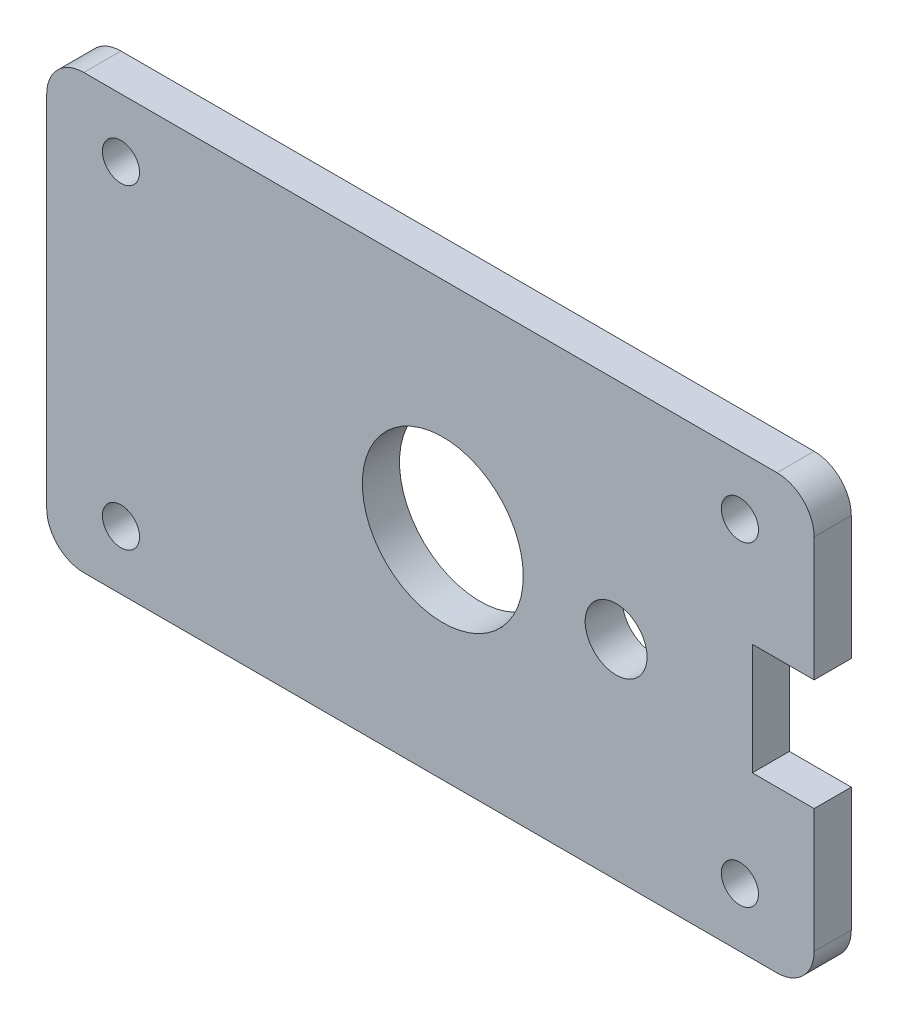
ISO-10303-21;
HEADER;
FILE_DESCRIPTION(('STEP AP214'),'2;1');
FILE_NAME('part.step','',(''),(''),'','','');
FILE_SCHEMA(('AUTOMOTIVE_DESIGN { 1 0 10303 214 1 1 1 1 }'));
ENDSEC;
DATA;
#1=APPLICATION_CONTEXT('core data for automotive mechanical design processes');
#2=APPLICATION_PROTOCOL_DEFINITION('international standard','automotive_design',2000,#1);
#3=PRODUCT_CONTEXT('',#1,'mechanical');
#4=PRODUCT('Part','Part','',(#3));
#5=PRODUCT_RELATED_PRODUCT_CATEGORY('part','',(#4));
#6=PRODUCT_DEFINITION_FORMATION('','',#4);
#7=PRODUCT_DEFINITION_CONTEXT('part definition',#1,'design');
#8=PRODUCT_DEFINITION('design','',#6,#7);
#9=PRODUCT_DEFINITION_SHAPE('','',#8);
#10=(LENGTH_UNIT() NAMED_UNIT(*) SI_UNIT(.MILLI.,.METRE.));
#11=(NAMED_UNIT(*) PLANE_ANGLE_UNIT() SI_UNIT($,.RADIAN.));
#12=(NAMED_UNIT(*) SI_UNIT($,.STERADIAN.) SOLID_ANGLE_UNIT());
#13=UNCERTAINTY_MEASURE_WITH_UNIT(LENGTH_MEASURE(1.E-05),#10,'distance_accuracy_value','');
#14=(GEOMETRIC_REPRESENTATION_CONTEXT(3) GLOBAL_UNCERTAINTY_ASSIGNED_CONTEXT((#13)) GLOBAL_UNIT_ASSIGNED_CONTEXT((#10,
#11,#12)) REPRESENTATION_CONTEXT('',''));
#15=CARTESIAN_POINT('',(0.,0.,0.));
#16=DIRECTION('',(0.,0.,1.));
#17=DIRECTION('',(1.,0.,0.));
#18=AXIS2_PLACEMENT_3D('',#15,#16,#17);
#19=CARTESIAN_POINT('',(28.,-14.5,3.));
#20=DIRECTION('',(0.,0.,1.));
#21=DIRECTION('',(1.,0.,0.));
#22=AXIS2_PLACEMENT_3D('',#19,#20,#21);
#23=PLANE('',#22);
#24=CARTESIAN_POINT('',(25.,-12.7500000000003,3.));
#25=DIRECTION('',(0.,0.,1.));
#26=DIRECTION('',(1.,0.,0.));
#27=AXIS2_PLACEMENT_3D('',#24,#25,#26);
#28=CIRCLE('',#27,1.5);
#29=CARTESIAN_POINT('',(26.5,-12.7500000000003,3.));
#30=VERTEX_POINT('',#29);
#31=EDGE_CURVE('E298',#30,#30,#28,.T.);
#32=ORIENTED_EDGE('',*,*,#31,.F.);
#33=EDGE_LOOP('',(#32));
#34=FACE_BOUND('',#33,.T.);
#35=CARTESIAN_POINT('',(-25.,12.7499999999997,3.));
#36=DIRECTION('',(0.,0.,1.));
#37=DIRECTION('',(1.,0.,0.));
#38=AXIS2_PLACEMENT_3D('',#35,#36,#37);
#39=CIRCLE('',#38,1.5);
#40=CARTESIAN_POINT('',(-23.5,12.7499999999997,3.));
#41=VERTEX_POINT('',#40);
#42=EDGE_CURVE('E310',#41,#41,#39,.T.);
#43=ORIENTED_EDGE('',*,*,#42,.F.);
#44=EDGE_LOOP('',(#43));
#45=FACE_BOUND('',#44,.T.);
#46=CARTESIAN_POINT('',(1.,-1.82145964977565E-13,3.));
#47=DIRECTION('',(0.,0.,1.));
#48=DIRECTION('',(1.,0.,0.));
#49=AXIS2_PLACEMENT_3D('',#46,#47,#48);
#50=CIRCLE('',#49,6.5);
#51=CARTESIAN_POINT('',(7.5,-1.82145964977565E-13,3.));
#52=VERTEX_POINT('',#51);
#53=EDGE_CURVE('E157',#52,#52,#50,.T.);
#54=ORIENTED_EDGE('',*,*,#53,.F.);
#55=EDGE_LOOP('',(#54));
#56=FACE_BOUND('',#55,.T.);
#57=DIRECTION('',(0.,1.,0.));
#58=VECTOR('',#57,1.);
#59=CARTESIAN_POINT('',(31.,14.5,3.));
#60=LINE('',#59,#58);
#61=CARTESIAN_POINT('',(31.,4.49999999999985,3.));
#62=VERTEX_POINT('',#61);
#63=CARTESIAN_POINT('',(31.,14.5,3.));
#64=VERTEX_POINT('',#63);
#65=EDGE_CURVE('E176',#62,#64,#60,.T.);
#66=ORIENTED_EDGE('',*,*,#65,.T.);
#67=CARTESIAN_POINT('',(28.,14.5,3.));
#68=DIRECTION('',(0.,0.,1.));
#69=DIRECTION('',(-1.,0.,0.));
#70=AXIS2_PLACEMENT_3D('',#67,#68,#69);
#71=CIRCLE('',#70,3.);
#72=CARTESIAN_POINT('',(28.,17.5,3.));
#73=VERTEX_POINT('',#72);
#74=EDGE_CURVE('E104',#64,#73,#71,.T.);
#75=ORIENTED_EDGE('',*,*,#74,.T.);
#76=DIRECTION('',(-1.,0.,0.));
#77=VECTOR('',#76,1.);
#78=CARTESIAN_POINT('',(-28.,17.5,3.));
#79=LINE('',#78,#77);
#80=CARTESIAN_POINT('',(-28.,17.5,3.));
#81=VERTEX_POINT('',#80);
#82=EDGE_CURVE('E203',#73,#81,#79,.T.);
#83=ORIENTED_EDGE('',*,*,#82,.T.);
#84=CARTESIAN_POINT('',(-28.,14.5,3.));
#85=DIRECTION('',(0.,0.,1.));
#86=DIRECTION('',(1.,0.,0.));
#87=AXIS2_PLACEMENT_3D('',#84,#85,#86);
#88=CIRCLE('',#87,3.);
#89=CARTESIAN_POINT('',(-31.,14.5,3.));
#90=VERTEX_POINT('',#89);
#91=EDGE_CURVE('E222',#81,#90,#88,.T.);
#92=ORIENTED_EDGE('',*,*,#91,.T.);
#93=DIRECTION('',(0.,-1.,0.));
#94=VECTOR('',#93,1.);
#95=CARTESIAN_POINT('',(-31.,14.5,3.));
#96=LINE('',#95,#94);
#97=CARTESIAN_POINT('',(-31.,-14.5,3.));
#98=VERTEX_POINT('',#97);
#99=EDGE_CURVE('E219',#90,#98,#96,.T.);
#100=ORIENTED_EDGE('',*,*,#99,.T.);
#101=CARTESIAN_POINT('',(-28.,-14.5,3.));
#102=DIRECTION('',(0.,0.,1.));
#103=DIRECTION('',(1.,0.,0.));
#104=AXIS2_PLACEMENT_3D('',#101,#102,#103);
#105=CIRCLE('',#104,3.);
#106=CARTESIAN_POINT('',(-28.,-17.5,3.));
#107=VERTEX_POINT('',#106);
#108=EDGE_CURVE('E221',#98,#107,#105,.T.);
#109=ORIENTED_EDGE('',*,*,#108,.T.);
#110=DIRECTION('',(1.,0.,0.));
#111=VECTOR('',#110,1.);
#112=CARTESIAN_POINT('',(-28.,-17.5,3.));
#113=LINE('',#112,#111);
#114=CARTESIAN_POINT('',(28.,-17.5,3.));
#115=VERTEX_POINT('',#114);
#116=EDGE_CURVE('E224',#107,#115,#113,.T.);
#117=ORIENTED_EDGE('',*,*,#116,.T.);
#118=CARTESIAN_POINT('',(28.,-14.5,3.));
#119=DIRECTION('',(0.,0.,1.));
#120=DIRECTION('',(1.,0.,0.));
#121=AXIS2_PLACEMENT_3D('',#118,#119,#120);
#122=CIRCLE('',#121,2.99999999999999);
#123=CARTESIAN_POINT('',(31.,-14.5,3.));
#124=VERTEX_POINT('',#123);
#125=EDGE_CURVE('E230',#115,#124,#122,.T.);
#126=ORIENTED_EDGE('',*,*,#125,.T.);
#127=DIRECTION('',(0.,1.,0.));
#128=VECTOR('',#127,1.);
#129=CARTESIAN_POINT('',(31.,-4.50000000000015,3.));
#130=LINE('',#129,#128);
#131=CARTESIAN_POINT('',(31.,-4.50000000000015,3.));
#132=VERTEX_POINT('',#131);
#133=EDGE_CURVE('E135',#124,#132,#130,.T.);
#134=ORIENTED_EDGE('',*,*,#133,.T.);
#135=DIRECTION('',(-1.,0.,0.));
#136=VECTOR('',#135,1.);
#137=CARTESIAN_POINT('',(26.,-4.50000000000015,3.));
#138=LINE('',#137,#136);
#139=CARTESIAN_POINT('',(26.,-4.50000000000015,3.));
#140=VERTEX_POINT('',#139);
#141=EDGE_CURVE('E129',#132,#140,#138,.T.);
#142=ORIENTED_EDGE('',*,*,#141,.T.);
#143=DIRECTION('',(0.,1.,0.));
#144=VECTOR('',#143,1.);
#145=CARTESIAN_POINT('',(26.,4.49999999999985,3.));
#146=LINE('',#145,#144);
#147=CARTESIAN_POINT('',(26.,4.49999999999985,3.));
#148=VERTEX_POINT('',#147);
#149=EDGE_CURVE('E133',#140,#148,#146,.T.);
#150=ORIENTED_EDGE('',*,*,#149,.T.);
#151=DIRECTION('',(1.,0.,0.));
#152=VECTOR('',#151,1.);
#153=CARTESIAN_POINT('',(31.,4.49999999999985,3.));
#154=LINE('',#153,#152);
#155=EDGE_CURVE('E49',#148,#62,#154,.T.);
#156=ORIENTED_EDGE('',*,*,#155,.T.);
#157=EDGE_LOOP('',(#66,#75,#83,#92,#100,#109,#117,#126,#134,#142,#150,#156));
#158=FACE_BOUND('',#157,.T.);
#159=CARTESIAN_POINT('',(15.,-0.654521383741324,3.));
#160=DIRECTION('',(0.,0.,1.));
#161=DIRECTION('',(1.,0.,0.));
#162=AXIS2_PLACEMENT_3D('',#159,#160,#161);
#163=CIRCLE('',#162,2.5);
#164=CARTESIAN_POINT('',(17.5,-0.654521383741324,3.));
#165=VERTEX_POINT('',#164);
#166=EDGE_CURVE('E316',#165,#165,#163,.T.);
#167=ORIENTED_EDGE('',*,*,#166,.F.);
#168=EDGE_LOOP('',(#167));
#169=FACE_BOUND('',#168,.T.);
#170=CARTESIAN_POINT('',(25.,12.7499999999997,3.));
#171=DIRECTION('',(0.,0.,1.));
#172=DIRECTION('',(1.,0.,0.));
#173=AXIS2_PLACEMENT_3D('',#170,#171,#172);
#174=CIRCLE('',#173,1.5);
#175=CARTESIAN_POINT('',(26.5,12.7499999999997,3.));
#176=VERTEX_POINT('',#175);
#177=EDGE_CURVE('E304',#176,#176,#174,.T.);
#178=ORIENTED_EDGE('',*,*,#177,.F.);
#179=EDGE_LOOP('',(#178));
#180=FACE_BOUND('',#179,.T.);
#181=CARTESIAN_POINT('',(-25.,-12.7500000000003,3.));
#182=DIRECTION('',(0.,0.,1.));
#183=DIRECTION('',(1.,0.,0.));
#184=AXIS2_PLACEMENT_3D('',#181,#182,#183);
#185=CIRCLE('',#184,1.5);
#186=CARTESIAN_POINT('',(-23.5,-12.7500000000003,3.));
#187=VERTEX_POINT('',#186);
#188=EDGE_CURVE('E289',#187,#187,#185,.T.);
#189=ORIENTED_EDGE('',*,*,#188,.F.);
#190=EDGE_LOOP('',(#189));
#191=FACE_BOUND('',#190,.T.);
#192=ADVANCED_FACE('F32',(#34,#45,#56,#158,#169,#180,#191),#23,.T.);
#193=CARTESIAN_POINT('',(28.,-14.5,0.));
#194=DIRECTION('',(0.,0.,1.));
#195=DIRECTION('',(1.,0.,0.));
#196=AXIS2_PLACEMENT_3D('',#193,#194,#195);
#197=PLANE('',#196);
#198=DIRECTION('',(0.,1.,0.));
#199=VECTOR('',#198,1.);
#200=CARTESIAN_POINT('',(31.,14.5,0.));
#201=LINE('',#200,#199);
#202=CARTESIAN_POINT('',(31.,4.49999999999985,0.));
#203=VERTEX_POINT('',#202);
#204=CARTESIAN_POINT('',(31.,14.5,0.));
#205=VERTEX_POINT('',#204);
#206=EDGE_CURVE('E153',#203,#205,#201,.T.);
#207=ORIENTED_EDGE('',*,*,#206,.F.);
#208=DIRECTION('',(1.,0.,0.));
#209=VECTOR('',#208,1.);
#210=CARTESIAN_POINT('',(31.,4.49999999999985,0.));
#211=LINE('',#210,#209);
#212=CARTESIAN_POINT('',(26.,4.49999999999985,0.));
#213=VERTEX_POINT('',#212);
#214=EDGE_CURVE('E96',#213,#203,#211,.T.);
#215=ORIENTED_EDGE('',*,*,#214,.F.);
#216=DIRECTION('',(0.,1.,0.));
#217=VECTOR('',#216,1.);
#218=CARTESIAN_POINT('',(26.,4.49999999999985,0.));
#219=LINE('',#218,#217);
#220=CARTESIAN_POINT('',(26.,-4.50000000000015,0.));
#221=VERTEX_POINT('',#220);
#222=EDGE_CURVE('E90',#221,#213,#219,.T.);
#223=ORIENTED_EDGE('',*,*,#222,.F.);
#224=DIRECTION('',(-1.,0.,0.));
#225=VECTOR('',#224,1.);
#226=CARTESIAN_POINT('',(26.,-4.50000000000015,0.));
#227=LINE('',#226,#225);
#228=CARTESIAN_POINT('',(31.,-4.50000000000015,0.));
#229=VERTEX_POINT('',#228);
#230=EDGE_CURVE('E143',#229,#221,#227,.T.);
#231=ORIENTED_EDGE('',*,*,#230,.F.);
#232=DIRECTION('',(0.,1.,0.));
#233=VECTOR('',#232,1.);
#234=CARTESIAN_POINT('',(31.,-4.50000000000015,0.));
#235=LINE('',#234,#233);
#236=CARTESIAN_POINT('',(31.,-14.5,0.));
#237=VERTEX_POINT('',#236);
#238=EDGE_CURVE('E171',#237,#229,#235,.T.);
#239=ORIENTED_EDGE('',*,*,#238,.F.);
#240=CARTESIAN_POINT('',(28.,-14.5,0.));
#241=DIRECTION('',(0.,0.,1.));
#242=DIRECTION('',(1.,0.,0.));
#243=AXIS2_PLACEMENT_3D('',#240,#241,#242);
#244=CIRCLE('',#243,2.99999999999999);
#245=CARTESIAN_POINT('',(28.,-17.5,0.));
#246=VERTEX_POINT('',#245);
#247=EDGE_CURVE('E169',#246,#237,#244,.T.);
#248=ORIENTED_EDGE('',*,*,#247,.F.);
#249=DIRECTION('',(1.,0.,0.));
#250=VECTOR('',#249,1.);
#251=CARTESIAN_POINT('',(-28.,-17.5,0.));
#252=LINE('',#251,#250);
#253=CARTESIAN_POINT('',(-28.,-17.5,0.));
#254=VERTEX_POINT('',#253);
#255=EDGE_CURVE('E167',#254,#246,#252,.T.);
#256=ORIENTED_EDGE('',*,*,#255,.F.);
#257=CARTESIAN_POINT('',(-28.,-14.5,0.));
#258=DIRECTION('',(0.,0.,1.));
#259=DIRECTION('',(1.,0.,0.));
#260=AXIS2_PLACEMENT_3D('',#257,#258,#259);
#261=CIRCLE('',#260,3.);
#262=CARTESIAN_POINT('',(-31.,-14.5,0.));
#263=VERTEX_POINT('',#262);
#264=EDGE_CURVE('E165',#263,#254,#261,.T.);
#265=ORIENTED_EDGE('',*,*,#264,.F.);
#266=DIRECTION('',(0.,-1.,0.));
#267=VECTOR('',#266,1.);
#268=CARTESIAN_POINT('',(-31.,14.5,0.));
#269=LINE('',#268,#267);
#270=CARTESIAN_POINT('',(-31.,14.5,0.));
#271=VERTEX_POINT('',#270);
#272=EDGE_CURVE('E163',#271,#263,#269,.T.);
#273=ORIENTED_EDGE('',*,*,#272,.F.);
#274=CARTESIAN_POINT('',(-28.,14.5,0.));
#275=DIRECTION('',(0.,0.,1.));
#276=DIRECTION('',(1.,0.,0.));
#277=AXIS2_PLACEMENT_3D('',#274,#275,#276);
#278=CIRCLE('',#277,3.);
#279=CARTESIAN_POINT('',(-28.,17.5,0.));
#280=VERTEX_POINT('',#279);
#281=EDGE_CURVE('E161',#280,#271,#278,.T.);
#282=ORIENTED_EDGE('',*,*,#281,.F.);
#283=DIRECTION('',(-1.,0.,0.));
#284=VECTOR('',#283,1.);
#285=CARTESIAN_POINT('',(-28.,17.5,0.));
#286=LINE('',#285,#284);
#287=CARTESIAN_POINT('',(28.,17.5,0.));
#288=VERTEX_POINT('',#287);
#289=EDGE_CURVE('E159',#288,#280,#286,.T.);
#290=ORIENTED_EDGE('',*,*,#289,.F.);
#291=CARTESIAN_POINT('',(28.,14.5,0.));
#292=DIRECTION('',(0.,0.,1.));
#293=DIRECTION('',(-1.,0.,0.));
#294=AXIS2_PLACEMENT_3D('',#291,#292,#293);
#295=CIRCLE('',#294,3.);
#296=EDGE_CURVE('E156',#205,#288,#295,.T.);
#297=ORIENTED_EDGE('',*,*,#296,.F.);
#298=EDGE_LOOP('',(#207,#215,#223,#231,#239,#248,#256,#265,#273,#282,#290,#297));
#299=FACE_BOUND('',#298,.T.);
#300=CARTESIAN_POINT('',(1.,-1.82145964977565E-13,0.));
#301=DIRECTION('',(0.,0.,1.));
#302=DIRECTION('',(1.,0.,0.));
#303=AXIS2_PLACEMENT_3D('',#300,#301,#302);
#304=CIRCLE('',#303,6.5);
#305=CARTESIAN_POINT('',(7.5,-1.82145964977565E-13,0.));
#306=VERTEX_POINT('',#305);
#307=EDGE_CURVE('E319',#306,#306,#304,.T.);
#308=ORIENTED_EDGE('',*,*,#307,.T.);
#309=EDGE_LOOP('',(#308));
#310=FACE_BOUND('',#309,.T.);
#311=CARTESIAN_POINT('',(15.,-0.654521383741324,0.));
#312=DIRECTION('',(0.,0.,1.));
#313=DIRECTION('',(1.,0.,0.));
#314=AXIS2_PLACEMENT_3D('',#311,#312,#313);
#315=CIRCLE('',#314,2.5);
#316=CARTESIAN_POINT('',(17.5,-0.654521383741324,0.));
#317=VERTEX_POINT('',#316);
#318=EDGE_CURVE('E313',#317,#317,#315,.T.);
#319=ORIENTED_EDGE('',*,*,#318,.T.);
#320=EDGE_LOOP('',(#319));
#321=FACE_BOUND('',#320,.T.);
#322=CARTESIAN_POINT('',(-25.,12.7499999999997,0.));
#323=DIRECTION('',(0.,0.,1.));
#324=DIRECTION('',(1.,0.,0.));
#325=AXIS2_PLACEMENT_3D('',#322,#323,#324);
#326=CIRCLE('',#325,1.5);
#327=CARTESIAN_POINT('',(-23.5,12.7499999999997,0.));
#328=VERTEX_POINT('',#327);
#329=EDGE_CURVE('E307',#328,#328,#326,.T.);
#330=ORIENTED_EDGE('',*,*,#329,.T.);
#331=EDGE_LOOP('',(#330));
#332=FACE_BOUND('',#331,.T.);
#333=CARTESIAN_POINT('',(25.,12.7499999999997,0.));
#334=DIRECTION('',(0.,0.,1.));
#335=DIRECTION('',(1.,0.,0.));
#336=AXIS2_PLACEMENT_3D('',#333,#334,#335);
#337=CIRCLE('',#336,1.5);
#338=CARTESIAN_POINT('',(26.5,12.7499999999997,0.));
#339=VERTEX_POINT('',#338);
#340=EDGE_CURVE('E301',#339,#339,#337,.T.);
#341=ORIENTED_EDGE('',*,*,#340,.T.);
#342=EDGE_LOOP('',(#341));
#343=FACE_BOUND('',#342,.T.);
#344=CARTESIAN_POINT('',(25.,-12.7500000000003,0.));
#345=DIRECTION('',(0.,0.,1.));
#346=DIRECTION('',(1.,0.,0.));
#347=AXIS2_PLACEMENT_3D('',#344,#345,#346);
#348=CIRCLE('',#347,1.5);
#349=CARTESIAN_POINT('',(26.5,-12.7500000000003,0.));
#350=VERTEX_POINT('',#349);
#351=EDGE_CURVE('E295',#350,#350,#348,.T.);
#352=ORIENTED_EDGE('',*,*,#351,.T.);
#353=EDGE_LOOP('',(#352));
#354=FACE_BOUND('',#353,.T.);
#355=CARTESIAN_POINT('',(-25.,-12.7500000000003,0.));
#356=DIRECTION('',(0.,0.,1.));
#357=DIRECTION('',(1.,0.,0.));
#358=AXIS2_PLACEMENT_3D('',#355,#356,#357);
#359=CIRCLE('',#358,1.5);
#360=CARTESIAN_POINT('',(-23.5,-12.7500000000003,0.));
#361=VERTEX_POINT('',#360);
#362=EDGE_CURVE('E292',#361,#361,#359,.T.);
#363=ORIENTED_EDGE('',*,*,#362,.T.);
#364=EDGE_LOOP('',(#363));
#365=FACE_BOUND('',#364,.T.);
#366=ADVANCED_FACE('F207',(#299,#310,#321,#332,#343,#354,#365),#197,.F.);
#367=CARTESIAN_POINT('',(31.,14.5,3.));
#368=DIRECTION('',(-1.,0.,0.));
#369=DIRECTION('',(0.,0.,1.));
#370=AXIS2_PLACEMENT_3D('',#367,#368,#369);
#371=PLANE('',#370);
#372=ORIENTED_EDGE('',*,*,#206,.T.);
#373=DIRECTION('',(0.,0.,-1.));
#374=VECTOR('',#373,1.);
#375=CARTESIAN_POINT('',(31.,14.5,3.));
#376=LINE('',#375,#374);
#377=EDGE_CURVE('E11',#64,#205,#376,.T.);
#378=ORIENTED_EDGE('',*,*,#377,.F.);
#379=ORIENTED_EDGE('',*,*,#65,.F.);
#380=DIRECTION('',(0.,0.,-1.));
#381=VECTOR('',#380,1.);
#382=CARTESIAN_POINT('',(31.,4.49999999999985,3.));
#383=LINE('',#382,#381);
#384=EDGE_CURVE('E149',#62,#203,#383,.T.);
#385=ORIENTED_EDGE('',*,*,#384,.T.);
#386=EDGE_LOOP('',(#372,#378,#379,#385));
#387=FACE_BOUND('',#386,.T.);
#388=ADVANCED_FACE('F34',(#387),#371,.F.);
#389=CARTESIAN_POINT('',(28.,14.5,3.));
#390=DIRECTION('',(0.,0.,-1.));
#391=DIRECTION('',(-1.,0.,0.));
#392=AXIS2_PLACEMENT_3D('',#389,#390,#391);
#393=CYLINDRICAL_SURFACE('',#392,3.);
#394=ORIENTED_EDGE('',*,*,#296,.T.);
#395=DIRECTION('',(0.,0.,-1.));
#396=VECTOR('',#395,1.);
#397=CARTESIAN_POINT('',(28.,17.5,3.));
#398=LINE('',#397,#396);
#399=EDGE_CURVE('E41',#73,#288,#398,.T.);
#400=ORIENTED_EDGE('',*,*,#399,.F.);
#401=ORIENTED_EDGE('',*,*,#74,.F.);
#402=ORIENTED_EDGE('',*,*,#377,.T.);
#403=EDGE_LOOP('',(#394,#400,#401,#402));
#404=FACE_BOUND('',#403,.T.);
#405=ADVANCED_FACE('F447',(#404),#393,.T.);
#406=CARTESIAN_POINT('',(-28.,17.5,3.));
#407=DIRECTION('',(0.,-1.,0.));
#408=DIRECTION('',(0.,0.,-1.));
#409=AXIS2_PLACEMENT_3D('',#406,#407,#408);
#410=PLANE('',#409);
#411=ORIENTED_EDGE('',*,*,#289,.T.);
#412=DIRECTION('',(0.,0.,-1.));
#413=VECTOR('',#412,1.);
#414=CARTESIAN_POINT('',(-28.,17.5,3.));
#415=LINE('',#414,#413);
#416=EDGE_CURVE('E195',#81,#280,#415,.T.);
#417=ORIENTED_EDGE('',*,*,#416,.F.);
#418=ORIENTED_EDGE('',*,*,#82,.F.);
#419=ORIENTED_EDGE('',*,*,#399,.T.);
#420=EDGE_LOOP('',(#411,#417,#418,#419));
#421=FACE_BOUND('',#420,.T.);
#422=ADVANCED_FACE('F201',(#421),#410,.F.);
#423=CARTESIAN_POINT('',(-28.,14.5,3.));
#424=DIRECTION('',(0.,0.,-1.));
#425=DIRECTION('',(-1.,0.,0.));
#426=AXIS2_PLACEMENT_3D('',#423,#424,#425);
#427=CYLINDRICAL_SURFACE('',#426,3.);
#428=ORIENTED_EDGE('',*,*,#281,.T.);
#429=DIRECTION('',(0.,0.,-1.));
#430=VECTOR('',#429,1.);
#431=CARTESIAN_POINT('',(-31.,14.5,3.));
#432=LINE('',#431,#430);
#433=EDGE_CURVE('E192',#90,#271,#432,.T.);
#434=ORIENTED_EDGE('',*,*,#433,.F.);
#435=ORIENTED_EDGE('',*,*,#91,.F.);
#436=ORIENTED_EDGE('',*,*,#416,.T.);
#437=EDGE_LOOP('',(#428,#434,#435,#436));
#438=FACE_BOUND('',#437,.T.);
#439=ADVANCED_FACE('F213',(#438),#427,.T.);
#440=CARTESIAN_POINT('',(-31.,14.5,3.));
#441=DIRECTION('',(1.,0.,0.));
#442=DIRECTION('',(0.,0.,-1.));
#443=AXIS2_PLACEMENT_3D('',#440,#441,#442);
#444=PLANE('',#443);
#445=ORIENTED_EDGE('',*,*,#272,.T.);
#446=DIRECTION('',(0.,0.,-1.));
#447=VECTOR('',#446,1.);
#448=CARTESIAN_POINT('',(-31.,-14.5,3.));
#449=LINE('',#448,#447);
#450=EDGE_CURVE('E189',#98,#263,#449,.T.);
#451=ORIENTED_EDGE('',*,*,#450,.F.);
#452=ORIENTED_EDGE('',*,*,#99,.F.);
#453=ORIENTED_EDGE('',*,*,#433,.T.);
#454=EDGE_LOOP('',(#445,#451,#452,#453));
#455=FACE_BOUND('',#454,.T.);
#456=ADVANCED_FACE('F217',(#455),#444,.F.);
#457=CARTESIAN_POINT('',(-28.,-14.5,3.));
#458=DIRECTION('',(0.,0.,-1.));
#459=DIRECTION('',(-1.,0.,0.));
#460=AXIS2_PLACEMENT_3D('',#457,#458,#459);
#461=CYLINDRICAL_SURFACE('',#460,3.);
#462=ORIENTED_EDGE('',*,*,#264,.T.);
#463=DIRECTION('',(0.,0.,-1.));
#464=VECTOR('',#463,1.);
#465=CARTESIAN_POINT('',(-28.,-17.5,3.));
#466=LINE('',#465,#464);
#467=EDGE_CURVE('E186',#107,#254,#466,.T.);
#468=ORIENTED_EDGE('',*,*,#467,.F.);
#469=ORIENTED_EDGE('',*,*,#108,.F.);
#470=ORIENTED_EDGE('',*,*,#450,.T.);
#471=EDGE_LOOP('',(#462,#468,#469,#470));
#472=FACE_BOUND('',#471,.T.);
#473=ADVANCED_FACE('F412',(#472),#461,.T.);
#474=CARTESIAN_POINT('',(-28.,-17.5,3.));
#475=DIRECTION('',(0.,1.,0.));
#476=DIRECTION('',(0.,0.,1.));
#477=AXIS2_PLACEMENT_3D('',#474,#475,#476);
#478=PLANE('',#477);
#479=ORIENTED_EDGE('',*,*,#255,.T.);
#480=DIRECTION('',(0.,0.,-1.));
#481=VECTOR('',#480,1.);
#482=CARTESIAN_POINT('',(28.,-17.5,3.));
#483=LINE('',#482,#481);
#484=EDGE_CURVE('E183',#115,#246,#483,.T.);
#485=ORIENTED_EDGE('',*,*,#484,.F.);
#486=ORIENTED_EDGE('',*,*,#116,.F.);
#487=ORIENTED_EDGE('',*,*,#467,.T.);
#488=EDGE_LOOP('',(#479,#485,#486,#487));
#489=FACE_BOUND('',#488,.T.);
#490=ADVANCED_FACE('F403',(#489),#478,.F.);
#491=CARTESIAN_POINT('',(28.,-14.5,3.));
#492=DIRECTION('',(0.,0.,-1.));
#493=DIRECTION('',(-1.,0.,0.));
#494=AXIS2_PLACEMENT_3D('',#491,#492,#493);
#495=CYLINDRICAL_SURFACE('',#494,2.99999999999999);
#496=ORIENTED_EDGE('',*,*,#247,.T.);
#497=DIRECTION('',(0.,0.,-1.));
#498=VECTOR('',#497,1.);
#499=CARTESIAN_POINT('',(31.,-14.5,3.));
#500=LINE('',#499,#498);
#501=EDGE_CURVE('E180',#124,#237,#500,.T.);
#502=ORIENTED_EDGE('',*,*,#501,.F.);
#503=ORIENTED_EDGE('',*,*,#125,.F.);
#504=ORIENTED_EDGE('',*,*,#484,.T.);
#505=EDGE_LOOP('',(#496,#502,#503,#504));
#506=FACE_BOUND('',#505,.T.);
#507=ADVANCED_FACE('F236',(#506),#495,.T.);
#508=CARTESIAN_POINT('',(31.,-4.50000000000015,3.));
#509=DIRECTION('',(-1.,0.,0.));
#510=DIRECTION('',(0.,-1.,0.));
#511=AXIS2_PLACEMENT_3D('',#508,#509,#510);
#512=PLANE('',#511);
#513=ORIENTED_EDGE('',*,*,#238,.T.);
#514=DIRECTION('',(0.,0.,-1.));
#515=VECTOR('',#514,1.);
#516=CARTESIAN_POINT('',(31.,-4.50000000000015,3.));
#517=LINE('',#516,#515);
#518=EDGE_CURVE('E144',#132,#229,#517,.T.);
#519=ORIENTED_EDGE('',*,*,#518,.F.);
#520=ORIENTED_EDGE('',*,*,#133,.F.);
#521=ORIENTED_EDGE('',*,*,#501,.T.);
#522=EDGE_LOOP('',(#513,#519,#520,#521));
#523=FACE_BOUND('',#522,.T.);
#524=ADVANCED_FACE('F240',(#523),#512,.F.);
#525=CARTESIAN_POINT('',(26.,-4.50000000000015,3.));
#526=DIRECTION('',(0.,-1.,0.));
#527=DIRECTION('',(0.,0.,-1.));
#528=AXIS2_PLACEMENT_3D('',#525,#526,#527);
#529=PLANE('',#528);
#530=ORIENTED_EDGE('',*,*,#230,.T.);
#531=DIRECTION('',(0.,0.,-1.));
#532=VECTOR('',#531,1.);
#533=CARTESIAN_POINT('',(26.,-4.50000000000015,3.));
#534=LINE('',#533,#532);
#535=EDGE_CURVE('E140',#140,#221,#534,.T.);
#536=ORIENTED_EDGE('',*,*,#535,.F.);
#537=ORIENTED_EDGE('',*,*,#141,.F.);
#538=ORIENTED_EDGE('',*,*,#518,.T.);
#539=EDGE_LOOP('',(#530,#536,#537,#538));
#540=FACE_BOUND('',#539,.T.);
#541=ADVANCED_FACE('F141',(#540),#529,.F.);
#542=CARTESIAN_POINT('',(26.,4.49999999999985,3.));
#543=DIRECTION('',(-1.,0.,0.));
#544=DIRECTION('',(0.,0.,1.));
#545=AXIS2_PLACEMENT_3D('',#542,#543,#544);
#546=PLANE('',#545);
#547=ORIENTED_EDGE('',*,*,#222,.T.);
#548=DIRECTION('',(0.,0.,-1.));
#549=VECTOR('',#548,1.);
#550=CARTESIAN_POINT('',(26.,4.49999999999985,3.));
#551=LINE('',#550,#549);
#552=EDGE_CURVE('E145',#148,#213,#551,.T.);
#553=ORIENTED_EDGE('',*,*,#552,.F.);
#554=ORIENTED_EDGE('',*,*,#149,.F.);
#555=ORIENTED_EDGE('',*,*,#535,.T.);
#556=EDGE_LOOP('',(#547,#553,#554,#555));
#557=FACE_BOUND('',#556,.T.);
#558=ADVANCED_FACE('F147',(#557),#546,.F.);
#559=CARTESIAN_POINT('',(31.,4.49999999999985,3.));
#560=DIRECTION('',(0.,1.,0.));
#561=DIRECTION('',(0.,0.,1.));
#562=AXIS2_PLACEMENT_3D('',#559,#560,#561);
#563=PLANE('',#562);
#564=ORIENTED_EDGE('',*,*,#214,.T.);
#565=ORIENTED_EDGE('',*,*,#384,.F.);
#566=ORIENTED_EDGE('',*,*,#155,.F.);
#567=ORIENTED_EDGE('',*,*,#552,.T.);
#568=EDGE_LOOP('',(#564,#565,#566,#567));
#569=FACE_BOUND('',#568,.T.);
#570=ADVANCED_FACE('F244',(#569),#563,.F.);
#571=CARTESIAN_POINT('',(1.,-1.82145964977565E-13,3.));
#572=DIRECTION('',(0.,0.,-1.));
#573=DIRECTION('',(-1.,0.,0.));
#574=AXIS2_PLACEMENT_3D('',#571,#572,#573);
#575=CYLINDRICAL_SURFACE('',#574,6.5);
#576=ORIENTED_EDGE('',*,*,#53,.T.);
#577=EDGE_LOOP('',(#576));
#578=FACE_BOUND('',#577,.T.);
#579=ORIENTED_EDGE('',*,*,#307,.F.);
#580=EDGE_LOOP('',(#579));
#581=FACE_BOUND('',#580,.T.);
#582=ADVANCED_FACE('F246',(#578,#581),#575,.F.);
#583=CARTESIAN_POINT('',(15.,-0.654521383741324,3.));
#584=DIRECTION('',(0.,0.,-1.));
#585=DIRECTION('',(-1.,0.,0.));
#586=AXIS2_PLACEMENT_3D('',#583,#584,#585);
#587=CYLINDRICAL_SURFACE('',#586,2.5);
#588=ORIENTED_EDGE('',*,*,#166,.T.);
#589=EDGE_LOOP('',(#588));
#590=FACE_BOUND('',#589,.T.);
#591=ORIENTED_EDGE('',*,*,#318,.F.);
#592=EDGE_LOOP('',(#591));
#593=FACE_BOUND('',#592,.T.);
#594=ADVANCED_FACE('F252',(#590,#593),#587,.F.);
#595=CARTESIAN_POINT('',(-25.,12.7499999999997,3.));
#596=DIRECTION('',(0.,0.,-1.));
#597=DIRECTION('',(-1.,0.,0.));
#598=AXIS2_PLACEMENT_3D('',#595,#596,#597);
#599=CYLINDRICAL_SURFACE('',#598,1.5);
#600=ORIENTED_EDGE('',*,*,#42,.T.);
#601=EDGE_LOOP('',(#600));
#602=FACE_BOUND('',#601,.T.);
#603=ORIENTED_EDGE('',*,*,#329,.F.);
#604=EDGE_LOOP('',(#603));
#605=FACE_BOUND('',#604,.T.);
#606=ADVANCED_FACE('F268',(#602,#605),#599,.F.);
#607=CARTESIAN_POINT('',(25.,12.7499999999997,3.));
#608=DIRECTION('',(0.,0.,-1.));
#609=DIRECTION('',(-1.,0.,0.));
#610=AXIS2_PLACEMENT_3D('',#607,#608,#609);
#611=CYLINDRICAL_SURFACE('',#610,1.5);
#612=ORIENTED_EDGE('',*,*,#177,.T.);
#613=EDGE_LOOP('',(#612));
#614=FACE_BOUND('',#613,.T.);
#615=ORIENTED_EDGE('',*,*,#340,.F.);
#616=EDGE_LOOP('',(#615));
#617=FACE_BOUND('',#616,.T.);
#618=ADVANCED_FACE('F272',(#614,#617),#611,.F.);
#619=CARTESIAN_POINT('',(25.,-12.7500000000003,3.));
#620=DIRECTION('',(0.,0.,-1.));
#621=DIRECTION('',(-1.,0.,0.));
#622=AXIS2_PLACEMENT_3D('',#619,#620,#621);
#623=CYLINDRICAL_SURFACE('',#622,1.5);
#624=ORIENTED_EDGE('',*,*,#31,.T.);
#625=EDGE_LOOP('',(#624));
#626=FACE_BOUND('',#625,.T.);
#627=ORIENTED_EDGE('',*,*,#351,.F.);
#628=EDGE_LOOP('',(#627));
#629=FACE_BOUND('',#628,.T.);
#630=ADVANCED_FACE('F276',(#626,#629),#623,.F.);
#631=CARTESIAN_POINT('',(-25.,-12.7500000000003,3.));
#632=DIRECTION('',(0.,0.,-1.));
#633=DIRECTION('',(-1.,0.,0.));
#634=AXIS2_PLACEMENT_3D('',#631,#632,#633);
#635=CYLINDRICAL_SURFACE('',#634,1.5);
#636=ORIENTED_EDGE('',*,*,#188,.T.);
#637=EDGE_LOOP('',(#636));
#638=FACE_BOUND('',#637,.T.);
#639=ORIENTED_EDGE('',*,*,#362,.F.);
#640=EDGE_LOOP('',(#639));
#641=FACE_BOUND('',#640,.T.);
#642=ADVANCED_FACE('F280',(#638,#641),#635,.F.);
#643=CLOSED_SHELL('',(#192,#366,#388,#405,#422,#439,#456,#473,#490,#507,#524,#541,#558,#570,
#582,#594,#606,#618,#630,#642));
#644=MANIFOLD_SOLID_BREP('B2',#643);
#645=ADVANCED_BREP_SHAPE_REPRESENTATION('',(#18,#644),#14);
#646=SHAPE_DEFINITION_REPRESENTATION(#9,#645);
ENDSEC;
END-ISO-10303-21;
